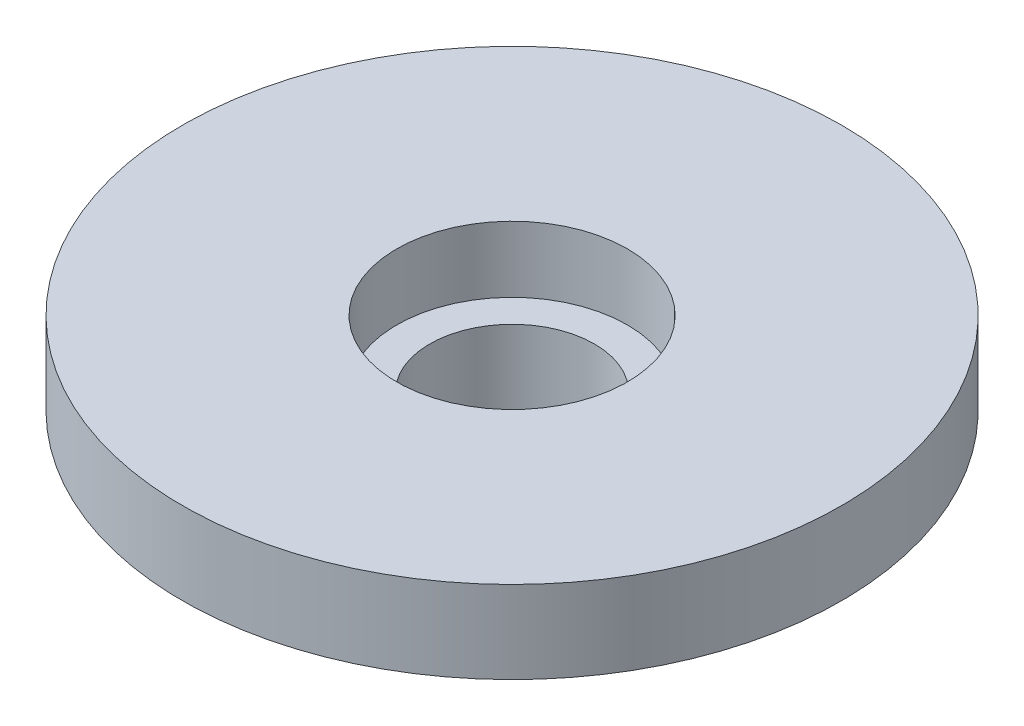
ISO-10303-21;
HEADER;
FILE_DESCRIPTION(('STEP AP214'),'2;1');
FILE_NAME('part.step','',(''),(''),'','','');
FILE_SCHEMA(('AUTOMOTIVE_DESIGN { 1 0 10303 214 1 1 1 1 }'));
ENDSEC;
DATA;
#1=APPLICATION_CONTEXT('core data for automotive mechanical design processes');
#2=APPLICATION_PROTOCOL_DEFINITION('international standard','automotive_design',2000,#1);
#3=PRODUCT_CONTEXT('',#1,'mechanical');
#4=PRODUCT('Part','Part','',(#3));
#5=PRODUCT_RELATED_PRODUCT_CATEGORY('part','',(#4));
#6=PRODUCT_DEFINITION_FORMATION('','',#4);
#7=PRODUCT_DEFINITION_CONTEXT('part definition',#1,'design');
#8=PRODUCT_DEFINITION('design','',#6,#7);
#9=PRODUCT_DEFINITION_SHAPE('','',#8);
#10=(LENGTH_UNIT() NAMED_UNIT(*) SI_UNIT(.MILLI.,.METRE.));
#11=(NAMED_UNIT(*) PLANE_ANGLE_UNIT() SI_UNIT($,.RADIAN.));
#12=(NAMED_UNIT(*) SI_UNIT($,.STERADIAN.) SOLID_ANGLE_UNIT());
#13=UNCERTAINTY_MEASURE_WITH_UNIT(LENGTH_MEASURE(1.E-05),#10,'distance_accuracy_value','');
#14=(GEOMETRIC_REPRESENTATION_CONTEXT(3) GLOBAL_UNCERTAINTY_ASSIGNED_CONTEXT((#13)) GLOBAL_UNIT_ASSIGNED_CONTEXT((#10,
#11,#12)) REPRESENTATION_CONTEXT('',''));
#15=CARTESIAN_POINT('',(0.,0.,0.));
#16=DIRECTION('',(0.,0.,1.));
#17=DIRECTION('',(1.,0.,0.));
#18=AXIS2_PLACEMENT_3D('',#15,#16,#17);
#19=CARTESIAN_POINT('',(0.,0.,0.));
#20=DIRECTION('',(0.,-1.,0.));
#21=DIRECTION('',(0.,0.,-1.));
#22=AXIS2_PLACEMENT_3D('',#19,#20,#21);
#23=CYLINDRICAL_SURFACE('',#22,2.5);
#24=CARTESIAN_POINT('',(0.,0.,0.));
#25=DIRECTION('',(0.,-1.,0.));
#26=DIRECTION('',(0.,0.,-1.));
#27=AXIS2_PLACEMENT_3D('',#24,#25,#26);
#28=CIRCLE('',#27,2.5);
#29=CARTESIAN_POINT('',(0.,0.,-2.5));
#30=VERTEX_POINT('',#29);
#31=EDGE_CURVE('E59',#30,#30,#28,.T.);
#32=ORIENTED_EDGE('',*,*,#31,.T.);
#33=EDGE_LOOP('',(#32));
#34=FACE_BOUND('',#33,.T.);
#35=CARTESIAN_POINT('',(0.,2.5,0.));
#36=DIRECTION('',(0.,-1.,0.));
#37=DIRECTION('',(0.,0.,-1.));
#38=AXIS2_PLACEMENT_3D('',#35,#36,#37);
#39=CIRCLE('',#38,2.5);
#40=CARTESIAN_POINT('',(0.,2.5,-2.5));
#41=VERTEX_POINT('',#40);
#42=EDGE_CURVE('E10',#41,#41,#39,.T.);
#43=ORIENTED_EDGE('',*,*,#42,.F.);
#44=EDGE_LOOP('',(#43));
#45=FACE_BOUND('',#44,.T.);
#46=ADVANCED_FACE('F31',(#34,#45),#23,.F.);
#47=CARTESIAN_POINT('',(2.5,2.5,0.));
#48=DIRECTION('',(0.,1.,0.));
#49=DIRECTION('',(0.,0.,1.));
#50=AXIS2_PLACEMENT_3D('',#47,#48,#49);
#51=PLANE('',#50);
#52=ORIENTED_EDGE('',*,*,#42,.T.);
#53=EDGE_LOOP('',(#52));
#54=FACE_BOUND('',#53,.T.);
#55=CARTESIAN_POINT('',(0.,2.5,0.));
#56=DIRECTION('',(0.,-1.,0.));
#57=DIRECTION('',(0.,0.,-1.));
#58=AXIS2_PLACEMENT_3D('',#55,#56,#57);
#59=CIRCLE('',#58,3.5);
#60=CARTESIAN_POINT('',(0.,2.5,-3.5));
#61=VERTEX_POINT('',#60);
#62=EDGE_CURVE('E37',#61,#61,#59,.T.);
#63=ORIENTED_EDGE('',*,*,#62,.F.);
#64=EDGE_LOOP('',(#63));
#65=FACE_BOUND('',#64,.T.);
#66=ADVANCED_FACE('F77',(#54,#65),#51,.T.);
#67=CARTESIAN_POINT('',(0.,0.,0.));
#68=DIRECTION('',(0.,-1.,0.));
#69=DIRECTION('',(0.,0.,-1.));
#70=AXIS2_PLACEMENT_3D('',#67,#68,#69);
#71=CYLINDRICAL_SURFACE('',#70,3.5);
#72=ORIENTED_EDGE('',*,*,#62,.T.);
#73=EDGE_LOOP('',(#72));
#74=FACE_BOUND('',#73,.T.);
#75=CARTESIAN_POINT('',(0.,4.5,0.));
#76=DIRECTION('',(0.,-1.,0.));
#77=DIRECTION('',(0.,0.,-1.));
#78=AXIS2_PLACEMENT_3D('',#75,#76,#77);
#79=CIRCLE('',#78,3.5);
#80=CARTESIAN_POINT('',(0.,4.5,-3.5));
#81=VERTEX_POINT('',#80);
#82=EDGE_CURVE('E41',#81,#81,#79,.T.);
#83=ORIENTED_EDGE('',*,*,#82,.F.);
#84=EDGE_LOOP('',(#83));
#85=FACE_BOUND('',#84,.T.);
#86=ADVANCED_FACE('F81',(#74,#85),#71,.F.);
#87=CARTESIAN_POINT('',(3.5,4.5,0.));
#88=DIRECTION('',(0.,1.,0.));
#89=DIRECTION('',(0.,0.,1.));
#90=AXIS2_PLACEMENT_3D('',#87,#88,#89);
#91=PLANE('',#90);
#92=ORIENTED_EDGE('',*,*,#82,.T.);
#93=EDGE_LOOP('',(#92));
#94=FACE_BOUND('',#93,.T.);
#95=CARTESIAN_POINT('',(0.,4.5,0.));
#96=DIRECTION('',(0.,-1.,0.));
#97=DIRECTION('',(0.,0.,-1.));
#98=AXIS2_PLACEMENT_3D('',#95,#96,#97);
#99=CIRCLE('',#98,10.);
#100=CARTESIAN_POINT('',(0.,4.5,-10.));
#101=VERTEX_POINT('',#100);
#102=EDGE_CURVE('E45',#101,#101,#99,.T.);
#103=ORIENTED_EDGE('',*,*,#102,.F.);
#104=EDGE_LOOP('',(#103));
#105=FACE_BOUND('',#104,.T.);
#106=ADVANCED_FACE('F85',(#94,#105),#91,.T.);
#107=CARTESIAN_POINT('',(0.,0.,0.));
#108=DIRECTION('',(0.,-1.,0.));
#109=DIRECTION('',(0.,0.,-1.));
#110=AXIS2_PLACEMENT_3D('',#107,#108,#109);
#111=CYLINDRICAL_SURFACE('',#110,10.);
#112=ORIENTED_EDGE('',*,*,#102,.T.);
#113=EDGE_LOOP('',(#112));
#114=FACE_BOUND('',#113,.T.);
#115=CARTESIAN_POINT('',(0.,2.,0.));
#116=DIRECTION('',(0.,-1.,0.));
#117=DIRECTION('',(0.,0.,-1.));
#118=AXIS2_PLACEMENT_3D('',#115,#116,#117);
#119=CIRCLE('',#118,10.);
#120=CARTESIAN_POINT('',(0.,2.,-10.));
#121=VERTEX_POINT('',#120);
#122=EDGE_CURVE('E50',#121,#121,#119,.T.);
#123=ORIENTED_EDGE('',*,*,#122,.F.);
#124=EDGE_LOOP('',(#123));
#125=FACE_BOUND('',#124,.T.);
#126=ADVANCED_FACE('F91',(#114,#125),#111,.T.);
#127=CARTESIAN_POINT('',(10.,2.,0.));
#128=DIRECTION('',(0.,-1.,0.));
#129=DIRECTION('',(0.,0.,-1.));
#130=AXIS2_PLACEMENT_3D('',#127,#128,#129);
#131=PLANE('',#130);
#132=ORIENTED_EDGE('',*,*,#122,.T.);
#133=EDGE_LOOP('',(#132));
#134=FACE_BOUND('',#133,.T.);
#135=CARTESIAN_POINT('',(0.,2.,0.));
#136=DIRECTION('',(0.,-1.,0.));
#137=DIRECTION('',(0.,0.,-1.));
#138=AXIS2_PLACEMENT_3D('',#135,#136,#137);
#139=CIRCLE('',#138,5.);
#140=CARTESIAN_POINT('',(0.,2.,-5.));
#141=VERTEX_POINT('',#140);
#142=EDGE_CURVE('E53',#141,#141,#139,.T.);
#143=ORIENTED_EDGE('',*,*,#142,.F.);
#144=EDGE_LOOP('',(#143));
#145=FACE_BOUND('',#144,.T.);
#146=ADVANCED_FACE('F73',(#134,#145),#131,.T.);
#147=CARTESIAN_POINT('',(0.,0.,0.));
#148=DIRECTION('',(0.,-1.,0.));
#149=DIRECTION('',(0.,0.,-1.));
#150=AXIS2_PLACEMENT_3D('',#147,#148,#149);
#151=CYLINDRICAL_SURFACE('',#150,5.);
#152=ORIENTED_EDGE('',*,*,#142,.T.);
#153=EDGE_LOOP('',(#152));
#154=FACE_BOUND('',#153,.T.);
#155=CARTESIAN_POINT('',(0.,0.,0.));
#156=DIRECTION('',(0.,-1.,0.));
#157=DIRECTION('',(0.,0.,-1.));
#158=AXIS2_PLACEMENT_3D('',#155,#156,#157);
#159=CIRCLE('',#158,5.);
#160=CARTESIAN_POINT('',(0.,0.,-5.));
#161=VERTEX_POINT('',#160);
#162=EDGE_CURVE('E56',#161,#161,#159,.T.);
#163=ORIENTED_EDGE('',*,*,#162,.F.);
#164=EDGE_LOOP('',(#163));
#165=FACE_BOUND('',#164,.T.);
#166=ADVANCED_FACE('F67',(#154,#165),#151,.T.);
#167=CARTESIAN_POINT('',(5.,0.,0.));
#168=DIRECTION('',(0.,-1.,0.));
#169=DIRECTION('',(0.,0.,-1.));
#170=AXIS2_PLACEMENT_3D('',#167,#168,#169);
#171=PLANE('',#170);
#172=ORIENTED_EDGE('',*,*,#162,.T.);
#173=EDGE_LOOP('',(#172));
#174=FACE_BOUND('',#173,.T.);
#175=ORIENTED_EDGE('',*,*,#31,.F.);
#176=EDGE_LOOP('',(#175));
#177=FACE_BOUND('',#176,.T.);
#178=ADVANCED_FACE('F65',(#174,#177),#171,.T.);
#179=CLOSED_SHELL('',(#46,#66,#86,#106,#126,#146,#166,#178));
#180=MANIFOLD_SOLID_BREP('B2',#179);
#181=ADVANCED_BREP_SHAPE_REPRESENTATION('',(#18,#180),#14);
#182=SHAPE_DEFINITION_REPRESENTATION(#9,#181);
ENDSEC;
END-ISO-10303-21;
